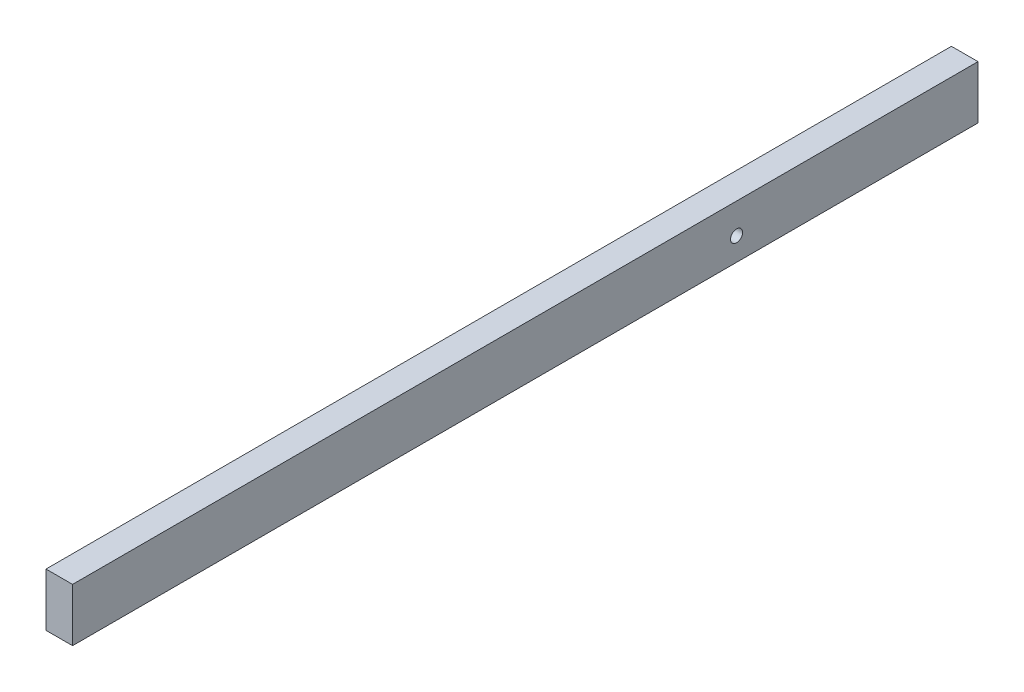
ISO-10303-21;
HEADER;
FILE_DESCRIPTION(('STEP AP214'),'2;1');
FILE_NAME('part.step','',(''),(''),'','','');
FILE_SCHEMA(('AUTOMOTIVE_DESIGN { 1 0 10303 214 1 1 1 1 }'));
ENDSEC;
DATA;
#1=APPLICATION_CONTEXT('core data for automotive mechanical design processes');
#2=APPLICATION_PROTOCOL_DEFINITION('international standard','automotive_design',2000,#1);
#3=PRODUCT_CONTEXT('',#1,'mechanical');
#4=PRODUCT('Part','Part','',(#3));
#5=PRODUCT_RELATED_PRODUCT_CATEGORY('part','',(#4));
#6=PRODUCT_DEFINITION_FORMATION('','',#4);
#7=PRODUCT_DEFINITION_CONTEXT('part definition',#1,'design');
#8=PRODUCT_DEFINITION('design','',#6,#7);
#9=PRODUCT_DEFINITION_SHAPE('','',#8);
#10=(LENGTH_UNIT() NAMED_UNIT(*) SI_UNIT(.MILLI.,.METRE.));
#11=(NAMED_UNIT(*) PLANE_ANGLE_UNIT() SI_UNIT($,.RADIAN.));
#12=(NAMED_UNIT(*) SI_UNIT($,.STERADIAN.) SOLID_ANGLE_UNIT());
#13=UNCERTAINTY_MEASURE_WITH_UNIT(LENGTH_MEASURE(1.E-05),#10,'distance_accuracy_value','');
#14=(GEOMETRIC_REPRESENTATION_CONTEXT(3) GLOBAL_UNCERTAINTY_ASSIGNED_CONTEXT((#13)) GLOBAL_UNIT_ASSIGNED_CONTEXT((#10,
#11,#12)) REPRESENTATION_CONTEXT('',''));
#15=CARTESIAN_POINT('',(0.,0.,0.));
#16=DIRECTION('',(0.,0.,1.));
#17=DIRECTION('',(1.,0.,0.));
#18=AXIS2_PLACEMENT_3D('',#15,#16,#17);
#19=CARTESIAN_POINT('',(11.01,22.,-375.01));
#20=DIRECTION('',(0.,1.,0.));
#21=DIRECTION('',(-1.,0.,0.));
#22=AXIS2_PLACEMENT_3D('',#19,#20,#21);
#23=PLANE('',#22);
#24=DIRECTION('',(0.,0.,1.));
#25=VECTOR('',#24,1.);
#26=CARTESIAN_POINT('',(11.,22.,0.));
#27=LINE('',#26,#25);
#28=CARTESIAN_POINT('',(11.,22.,-375.));
#29=VERTEX_POINT('',#28);
#30=CARTESIAN_POINT('',(11.,22.,375.));
#31=VERTEX_POINT('',#30);
#32=EDGE_CURVE('E90',#29,#31,#27,.T.);
#33=ORIENTED_EDGE('',*,*,#32,.F.);
#34=DIRECTION('',(1.,0.,0.));
#35=VECTOR('',#34,1.);
#36=CARTESIAN_POINT('',(0.,22.,-375.));
#37=LINE('',#36,#35);
#38=CARTESIAN_POINT('',(-11.,22.,-375.));
#39=VERTEX_POINT('',#38);
#40=EDGE_CURVE('E61',#39,#29,#37,.T.);
#41=ORIENTED_EDGE('',*,*,#40,.F.);
#42=DIRECTION('',(0.,0.,-1.));
#43=VECTOR('',#42,1.);
#44=CARTESIAN_POINT('',(-11.,22.,0.));
#45=LINE('',#44,#43);
#46=CARTESIAN_POINT('',(-11.,22.,375.));
#47=VERTEX_POINT('',#46);
#48=EDGE_CURVE('E70',#47,#39,#45,.T.);
#49=ORIENTED_EDGE('',*,*,#48,.F.);
#50=DIRECTION('',(-1.,0.,0.));
#51=VECTOR('',#50,1.);
#52=CARTESIAN_POINT('',(0.,22.,375.));
#53=LINE('',#52,#51);
#54=EDGE_CURVE('E62',#31,#47,#53,.T.);
#55=ORIENTED_EDGE('',*,*,#54,.F.);
#56=EDGE_LOOP('',(#33,#41,#49,#55));
#57=FACE_BOUND('',#56,.T.);
#58=ADVANCED_FACE('F16',(#57),#23,.T.);
#59=CARTESIAN_POINT('',(-11.01,-22.01,375.));
#60=DIRECTION('',(0.,0.,1.));
#61=DIRECTION('',(1.,0.,0.));
#62=AXIS2_PLACEMENT_3D('',#59,#60,#61);
#63=PLANE('',#62);
#64=DIRECTION('',(-1.,0.,0.));
#65=VECTOR('',#64,1.);
#66=CARTESIAN_POINT('',(0.,-22.,375.));
#67=LINE('',#66,#65);
#68=CARTESIAN_POINT('',(11.,-22.,375.));
#69=VERTEX_POINT('',#68);
#70=CARTESIAN_POINT('',(-11.,-22.,375.));
#71=VERTEX_POINT('',#70);
#72=EDGE_CURVE('E53',#69,#71,#67,.T.);
#73=ORIENTED_EDGE('',*,*,#72,.F.);
#74=DIRECTION('',(0.,-1.,0.));
#75=VECTOR('',#74,1.);
#76=CARTESIAN_POINT('',(11.,0.,375.));
#77=LINE('',#76,#75);
#78=EDGE_CURVE('E93',#31,#69,#77,.T.);
#79=ORIENTED_EDGE('',*,*,#78,.F.);
#80=ORIENTED_EDGE('',*,*,#54,.T.);
#81=DIRECTION('',(0.,1.,0.));
#82=VECTOR('',#81,1.);
#83=CARTESIAN_POINT('',(-11.,0.,375.));
#84=LINE('',#83,#82);
#85=EDGE_CURVE('E65',#71,#47,#84,.T.);
#86=ORIENTED_EDGE('',*,*,#85,.F.);
#87=EDGE_LOOP('',(#73,#79,#80,#86));
#88=FACE_BOUND('',#87,.T.);
#89=ADVANCED_FACE('F66',(#88),#63,.T.);
#90=CARTESIAN_POINT('',(-11.01,-22.,-375.01));
#91=DIRECTION('',(0.,-1.,0.));
#92=DIRECTION('',(1.,0.,0.));
#93=AXIS2_PLACEMENT_3D('',#90,#91,#92);
#94=PLANE('',#93);
#95=DIRECTION('',(0.,0.,1.));
#96=VECTOR('',#95,1.);
#97=CARTESIAN_POINT('',(-11.,-22.,0.));
#98=LINE('',#97,#96);
#99=CARTESIAN_POINT('',(-11.,-22.,-375.));
#100=VERTEX_POINT('',#99);
#101=EDGE_CURVE('E52',#100,#71,#98,.T.);
#102=ORIENTED_EDGE('',*,*,#101,.F.);
#103=DIRECTION('',(-1.,0.,0.));
#104=VECTOR('',#103,1.);
#105=CARTESIAN_POINT('',(0.,-22.,-375.));
#106=LINE('',#105,#104);
#107=CARTESIAN_POINT('',(11.,-22.,-375.));
#108=VERTEX_POINT('',#107);
#109=EDGE_CURVE('E33',#108,#100,#106,.T.);
#110=ORIENTED_EDGE('',*,*,#109,.F.);
#111=DIRECTION('',(0.,0.,-1.));
#112=VECTOR('',#111,1.);
#113=CARTESIAN_POINT('',(11.,-22.,0.));
#114=LINE('',#113,#112);
#115=EDGE_CURVE('E57',#69,#108,#114,.T.);
#116=ORIENTED_EDGE('',*,*,#115,.F.);
#117=ORIENTED_EDGE('',*,*,#72,.T.);
#118=EDGE_LOOP('',(#102,#110,#116,#117));
#119=FACE_BOUND('',#118,.T.);
#120=ADVANCED_FACE('F55',(#119),#94,.T.);
#121=CARTESIAN_POINT('',(11.01,-22.01,-375.));
#122=DIRECTION('',(0.,0.,-1.));
#123=DIRECTION('',(-1.,0.,0.));
#124=AXIS2_PLACEMENT_3D('',#121,#122,#123);
#125=PLANE('',#124);
#126=ORIENTED_EDGE('',*,*,#109,.T.);
#127=DIRECTION('',(0.,-1.,0.));
#128=VECTOR('',#127,1.);
#129=CARTESIAN_POINT('',(-11.,0.,-375.));
#130=LINE('',#129,#128);
#131=EDGE_CURVE('E75',#39,#100,#130,.T.);
#132=ORIENTED_EDGE('',*,*,#131,.F.);
#133=ORIENTED_EDGE('',*,*,#40,.T.);
#134=DIRECTION('',(0.,1.,0.));
#135=VECTOR('',#134,1.);
#136=CARTESIAN_POINT('',(11.,0.,-375.));
#137=LINE('',#136,#135);
#138=EDGE_CURVE('E85',#108,#29,#137,.T.);
#139=ORIENTED_EDGE('',*,*,#138,.F.);
#140=EDGE_LOOP('',(#126,#132,#133,#139));
#141=FACE_BOUND('',#140,.T.);
#142=ADVANCED_FACE('F84',(#141),#125,.T.);
#143=CARTESIAN_POINT('',(-11.,22.01,-375.01));
#144=DIRECTION('',(-1.,0.,0.));
#145=DIRECTION('',(0.,-1.,0.));
#146=AXIS2_PLACEMENT_3D('',#143,#144,#145);
#147=PLANE('',#146);
#148=CARTESIAN_POINT('',(-11.,-3.00000000000003,-175.));
#149=DIRECTION('',(-1.,0.,0.));
#150=DIRECTION('',(0.,0.,1.));
#151=AXIS2_PLACEMENT_3D('',#148,#149,#150);
#152=CIRCLE('',#151,4.99999999999997);
#153=CARTESIAN_POINT('',(-11.,-3.00000000000003,-170.));
#154=VERTEX_POINT('',#153);
#155=EDGE_CURVE('E20',#154,#154,#152,.T.);
#156=ORIENTED_EDGE('',*,*,#155,.F.);
#157=EDGE_LOOP('',(#156));
#158=FACE_BOUND('',#157,.T.);
#159=ORIENTED_EDGE('',*,*,#48,.T.);
#160=ORIENTED_EDGE('',*,*,#131,.T.);
#161=ORIENTED_EDGE('',*,*,#101,.T.);
#162=ORIENTED_EDGE('',*,*,#85,.T.);
#163=EDGE_LOOP('',(#159,#160,#161,#162));
#164=FACE_BOUND('',#163,.T.);
#165=ADVANCED_FACE('F73',(#158,#164),#147,.T.);
#166=CARTESIAN_POINT('',(11.,-22.01,-375.01));
#167=DIRECTION('',(1.,0.,0.));
#168=DIRECTION('',(0.,1.,0.));
#169=AXIS2_PLACEMENT_3D('',#166,#167,#168);
#170=PLANE('',#169);
#171=CARTESIAN_POINT('',(11.,-3.00000000000003,-175.));
#172=DIRECTION('',(-1.,0.,0.));
#173=DIRECTION('',(0.,0.,1.));
#174=AXIS2_PLACEMENT_3D('',#171,#172,#173);
#175=CIRCLE('',#174,4.99999999999997);
#176=CARTESIAN_POINT('',(11.,-3.00000000000003,-170.));
#177=VERTEX_POINT('',#176);
#178=EDGE_CURVE('E11',#177,#177,#175,.F.);
#179=ORIENTED_EDGE('',*,*,#178,.F.);
#180=EDGE_LOOP('',(#179));
#181=FACE_BOUND('',#180,.T.);
#182=ORIENTED_EDGE('',*,*,#115,.T.);
#183=ORIENTED_EDGE('',*,*,#138,.T.);
#184=ORIENTED_EDGE('',*,*,#32,.T.);
#185=ORIENTED_EDGE('',*,*,#78,.T.);
#186=EDGE_LOOP('',(#182,#183,#184,#185));
#187=FACE_BOUND('',#186,.T.);
#188=ADVANCED_FACE('F89',(#181,#187),#170,.T.);
#189=CARTESIAN_POINT('',(10.9999999999999,-3.00000000000003,-175.));
#190=DIRECTION('',(-1.,0.,0.));
#191=DIRECTION('',(0.,0.,1.));
#192=AXIS2_PLACEMENT_3D('',#189,#190,#191);
#193=CYLINDRICAL_SURFACE('',#192,4.99999999999997);
#194=ORIENTED_EDGE('',*,*,#178,.T.);
#195=EDGE_LOOP('',(#194));
#196=FACE_BOUND('',#195,.T.);
#197=ORIENTED_EDGE('',*,*,#155,.T.);
#198=EDGE_LOOP('',(#197));
#199=FACE_BOUND('',#198,.T.);
#200=ADVANCED_FACE('F18',(#196,#199),#193,.F.);
#201=CLOSED_SHELL('',(#58,#89,#120,#142,#165,#188,#200));
#202=MANIFOLD_SOLID_BREP('B1',#201);
#203=ADVANCED_BREP_SHAPE_REPRESENTATION('',(#18,#202),#14);
#204=SHAPE_DEFINITION_REPRESENTATION(#9,#203);
ENDSEC;
END-ISO-10303-21;
